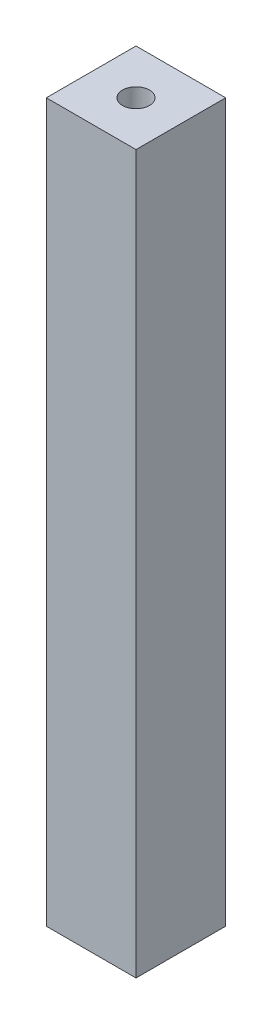
ISO-10303-21;
HEADER;
FILE_DESCRIPTION(('STEP AP214'),'2;1');
FILE_NAME('part.step','',(''),(''),'','','');
FILE_SCHEMA(('AUTOMOTIVE_DESIGN { 1 0 10303 214 1 1 1 1 }'));
ENDSEC;
DATA;
#1=APPLICATION_CONTEXT('core data for automotive mechanical design processes');
#2=APPLICATION_PROTOCOL_DEFINITION('international standard','automotive_design',2000,#1);
#3=PRODUCT_CONTEXT('',#1,'mechanical');
#4=PRODUCT('Part','Part','',(#3));
#5=PRODUCT_RELATED_PRODUCT_CATEGORY('part','',(#4));
#6=PRODUCT_DEFINITION_FORMATION('','',#4);
#7=PRODUCT_DEFINITION_CONTEXT('part definition',#1,'design');
#8=PRODUCT_DEFINITION('design','',#6,#7);
#9=PRODUCT_DEFINITION_SHAPE('','',#8);
#10=(LENGTH_UNIT() NAMED_UNIT(*) SI_UNIT(.MILLI.,.METRE.));
#11=(NAMED_UNIT(*) PLANE_ANGLE_UNIT() SI_UNIT($,.RADIAN.));
#12=(NAMED_UNIT(*) SI_UNIT($,.STERADIAN.) SOLID_ANGLE_UNIT());
#13=UNCERTAINTY_MEASURE_WITH_UNIT(LENGTH_MEASURE(1.E-05),#10,'distance_accuracy_value','');
#14=(GEOMETRIC_REPRESENTATION_CONTEXT(3) GLOBAL_UNCERTAINTY_ASSIGNED_CONTEXT((#13)) GLOBAL_UNIT_ASSIGNED_CONTEXT((#10,
#11,#12)) REPRESENTATION_CONTEXT('',''));
#15=CARTESIAN_POINT('',(0.,0.,0.));
#16=DIRECTION('',(0.,0.,1.));
#17=DIRECTION('',(1.,0.,0.));
#18=AXIS2_PLACEMENT_3D('',#15,#16,#17);
#19=CARTESIAN_POINT('',(5.,80.,5.));
#20=DIRECTION('',(-1.,0.,0.));
#21=DIRECTION('',(0.,0.,1.));
#22=AXIS2_PLACEMENT_3D('',#19,#20,#21);
#23=PLANE('',#22);
#24=DIRECTION('',(0.,0.,-1.));
#25=VECTOR('',#24,1.);
#26=CARTESIAN_POINT('',(5.,0.,5.));
#27=LINE('',#26,#25);
#28=CARTESIAN_POINT('',(5.,0.,5.));
#29=VERTEX_POINT('',#28);
#30=CARTESIAN_POINT('',(5.,0.,-5.));
#31=VERTEX_POINT('',#30);
#32=EDGE_CURVE('E96',#29,#31,#27,.T.);
#33=ORIENTED_EDGE('',*,*,#32,.T.);
#34=DIRECTION('',(0.,-1.,0.));
#35=VECTOR('',#34,1.);
#36=CARTESIAN_POINT('',(5.,80.,-5.));
#37=LINE('',#36,#35);
#38=CARTESIAN_POINT('',(5.,80.,-5.));
#39=VERTEX_POINT('',#38);
#40=EDGE_CURVE('E11',#39,#31,#37,.T.);
#41=ORIENTED_EDGE('',*,*,#40,.F.);
#42=DIRECTION('',(0.,0.,-1.));
#43=VECTOR('',#42,1.);
#44=CARTESIAN_POINT('',(5.,80.,5.));
#45=LINE('',#44,#43);
#46=CARTESIAN_POINT('',(5.,80.,5.));
#47=VERTEX_POINT('',#46);
#48=EDGE_CURVE('E84',#47,#39,#45,.T.);
#49=ORIENTED_EDGE('',*,*,#48,.F.);
#50=DIRECTION('',(0.,-1.,0.));
#51=VECTOR('',#50,1.);
#52=CARTESIAN_POINT('',(5.,80.,5.));
#53=LINE('',#52,#51);
#54=EDGE_CURVE('E92',#47,#29,#53,.T.);
#55=ORIENTED_EDGE('',*,*,#54,.T.);
#56=EDGE_LOOP('',(#33,#41,#49,#55));
#57=FACE_BOUND('',#56,.T.);
#58=ADVANCED_FACE('F33',(#57),#23,.F.);
#59=CARTESIAN_POINT('',(-5.,80.,-5.));
#60=DIRECTION('',(0.,0.,1.));
#61=DIRECTION('',(1.,0.,0.));
#62=AXIS2_PLACEMENT_3D('',#59,#60,#61);
#63=PLANE('',#62);
#64=DIRECTION('',(-1.,0.,0.));
#65=VECTOR('',#64,1.);
#66=CARTESIAN_POINT('',(-5.,0.,-5.));
#67=LINE('',#66,#65);
#68=CARTESIAN_POINT('',(-5.,0.,-5.));
#69=VERTEX_POINT('',#68);
#70=EDGE_CURVE('E88',#31,#69,#67,.T.);
#71=ORIENTED_EDGE('',*,*,#70,.T.);
#72=DIRECTION('',(0.,-1.,0.));
#73=VECTOR('',#72,1.);
#74=CARTESIAN_POINT('',(-5.,80.,-5.));
#75=LINE('',#74,#73);
#76=CARTESIAN_POINT('',(-5.,80.,-5.));
#77=VERTEX_POINT('',#76);
#78=EDGE_CURVE('E41',#77,#69,#75,.T.);
#79=ORIENTED_EDGE('',*,*,#78,.F.);
#80=DIRECTION('',(-1.,0.,0.));
#81=VECTOR('',#80,1.);
#82=CARTESIAN_POINT('',(-5.,80.,-5.));
#83=LINE('',#82,#81);
#84=EDGE_CURVE('E79',#39,#77,#83,.T.);
#85=ORIENTED_EDGE('',*,*,#84,.F.);
#86=ORIENTED_EDGE('',*,*,#40,.T.);
#87=EDGE_LOOP('',(#71,#79,#85,#86));
#88=FACE_BOUND('',#87,.T.);
#89=ADVANCED_FACE('F87',(#88),#63,.F.);
#90=CARTESIAN_POINT('',(-5.,80.,5.));
#91=DIRECTION('',(1.,0.,0.));
#92=DIRECTION('',(0.,0.,-1.));
#93=AXIS2_PLACEMENT_3D('',#90,#91,#92);
#94=PLANE('',#93);
#95=DIRECTION('',(0.,0.,1.));
#96=VECTOR('',#95,1.);
#97=CARTESIAN_POINT('',(-5.,0.,5.));
#98=LINE('',#97,#96);
#99=CARTESIAN_POINT('',(-5.,0.,5.));
#100=VERTEX_POINT('',#99);
#101=EDGE_CURVE('E66',#69,#100,#98,.T.);
#102=ORIENTED_EDGE('',*,*,#101,.T.);
#103=DIRECTION('',(0.,-1.,0.));
#104=VECTOR('',#103,1.);
#105=CARTESIAN_POINT('',(-5.,80.,5.));
#106=LINE('',#105,#104);
#107=CARTESIAN_POINT('',(-5.,80.,5.));
#108=VERTEX_POINT('',#107);
#109=EDGE_CURVE('E89',#108,#100,#106,.T.);
#110=ORIENTED_EDGE('',*,*,#109,.F.);
#111=DIRECTION('',(0.,0.,1.));
#112=VECTOR('',#111,1.);
#113=CARTESIAN_POINT('',(-5.,80.,5.));
#114=LINE('',#113,#112);
#115=EDGE_CURVE('E82',#77,#108,#114,.T.);
#116=ORIENTED_EDGE('',*,*,#115,.F.);
#117=ORIENTED_EDGE('',*,*,#78,.T.);
#118=EDGE_LOOP('',(#102,#110,#116,#117));
#119=FACE_BOUND('',#118,.T.);
#120=ADVANCED_FACE('F90',(#119),#94,.F.);
#121=CARTESIAN_POINT('',(-5.,80.,5.));
#122=DIRECTION('',(0.,0.,-1.));
#123=DIRECTION('',(-1.,0.,0.));
#124=AXIS2_PLACEMENT_3D('',#121,#122,#123);
#125=PLANE('',#124);
#126=DIRECTION('',(1.,0.,0.));
#127=VECTOR('',#126,1.);
#128=CARTESIAN_POINT('',(-5.,0.,5.));
#129=LINE('',#128,#127);
#130=EDGE_CURVE('E72',#100,#29,#129,.T.);
#131=ORIENTED_EDGE('',*,*,#130,.T.);
#132=ORIENTED_EDGE('',*,*,#54,.F.);
#133=DIRECTION('',(1.,0.,0.));
#134=VECTOR('',#133,1.);
#135=CARTESIAN_POINT('',(-5.,80.,5.));
#136=LINE('',#135,#134);
#137=EDGE_CURVE('E49',#108,#47,#136,.T.);
#138=ORIENTED_EDGE('',*,*,#137,.F.);
#139=ORIENTED_EDGE('',*,*,#109,.T.);
#140=EDGE_LOOP('',(#131,#132,#138,#139));
#141=FACE_BOUND('',#140,.T.);
#142=ADVANCED_FACE('F104',(#141),#125,.F.);
#143=CARTESIAN_POINT('',(0.,80.,0.));
#144=DIRECTION('',(0.,-1.,0.));
#145=DIRECTION('',(0.,0.,-1.));
#146=AXIS2_PLACEMENT_3D('',#143,#144,#145);
#147=PLANE('',#146);
#148=CARTESIAN_POINT('',(0.,80.,0.));
#149=DIRECTION('',(0.,1.,0.));
#150=DIRECTION('',(0.,0.,1.));
#151=AXIS2_PLACEMENT_3D('',#148,#149,#150);
#152=CIRCLE('',#151,1.5);
#153=CARTESIAN_POINT('',(0.,80.,1.5));
#154=VERTEX_POINT('',#153);
#155=EDGE_CURVE('E99',#154,#154,#152,.T.);
#156=ORIENTED_EDGE('',*,*,#155,.F.);
#157=EDGE_LOOP('',(#156));
#158=FACE_BOUND('',#157,.T.);
#159=ORIENTED_EDGE('',*,*,#48,.T.);
#160=ORIENTED_EDGE('',*,*,#84,.T.);
#161=ORIENTED_EDGE('',*,*,#115,.T.);
#162=ORIENTED_EDGE('',*,*,#137,.T.);
#163=EDGE_LOOP('',(#159,#160,#161,#162));
#164=FACE_BOUND('',#163,.T.);
#165=ADVANCED_FACE('F80',(#158,#164),#147,.F.);
#166=CARTESIAN_POINT('',(0.,0.,0.));
#167=DIRECTION('',(0.,-1.,0.));
#168=DIRECTION('',(0.,0.,-1.));
#169=AXIS2_PLACEMENT_3D('',#166,#167,#168);
#170=PLANE('',#169);
#171=CARTESIAN_POINT('',(0.,0.,0.));
#172=DIRECTION('',(0.,1.,0.));
#173=DIRECTION('',(0.,0.,1.));
#174=AXIS2_PLACEMENT_3D('',#171,#172,#173);
#175=CIRCLE('',#174,1.5);
#176=CARTESIAN_POINT('',(0.,0.,1.5));
#177=VERTEX_POINT('',#176);
#178=EDGE_CURVE('E110',#177,#177,#175,.T.);
#179=ORIENTED_EDGE('',*,*,#178,.T.);
#180=EDGE_LOOP('',(#179));
#181=FACE_BOUND('',#180,.T.);
#182=ORIENTED_EDGE('',*,*,#32,.F.);
#183=ORIENTED_EDGE('',*,*,#130,.F.);
#184=ORIENTED_EDGE('',*,*,#101,.F.);
#185=ORIENTED_EDGE('',*,*,#70,.F.);
#186=EDGE_LOOP('',(#182,#183,#184,#185));
#187=FACE_BOUND('',#186,.T.);
#188=ADVANCED_FACE('F107',(#181,#187),#170,.T.);
#189=CARTESIAN_POINT('',(0.,80.,0.));
#190=DIRECTION('',(0.,-1.,0.));
#191=DIRECTION('',(0.,0.,-1.));
#192=AXIS2_PLACEMENT_3D('',#189,#190,#191);
#193=CYLINDRICAL_SURFACE('',#192,1.5);
#194=ORIENTED_EDGE('',*,*,#155,.T.);
#195=EDGE_LOOP('',(#194));
#196=FACE_BOUND('',#195,.T.);
#197=ORIENTED_EDGE('',*,*,#178,.F.);
#198=EDGE_LOOP('',(#197));
#199=FACE_BOUND('',#198,.T.);
#200=ADVANCED_FACE('F116',(#196,#199),#193,.F.);
#201=CLOSED_SHELL('',(#58,#89,#120,#142,#165,#188,#200));
#202=MANIFOLD_SOLID_BREP('B2',#201);
#203=ADVANCED_BREP_SHAPE_REPRESENTATION('',(#18,#202),#14);
#204=SHAPE_DEFINITION_REPRESENTATION(#9,#203);
ENDSEC;
END-ISO-10303-21;
